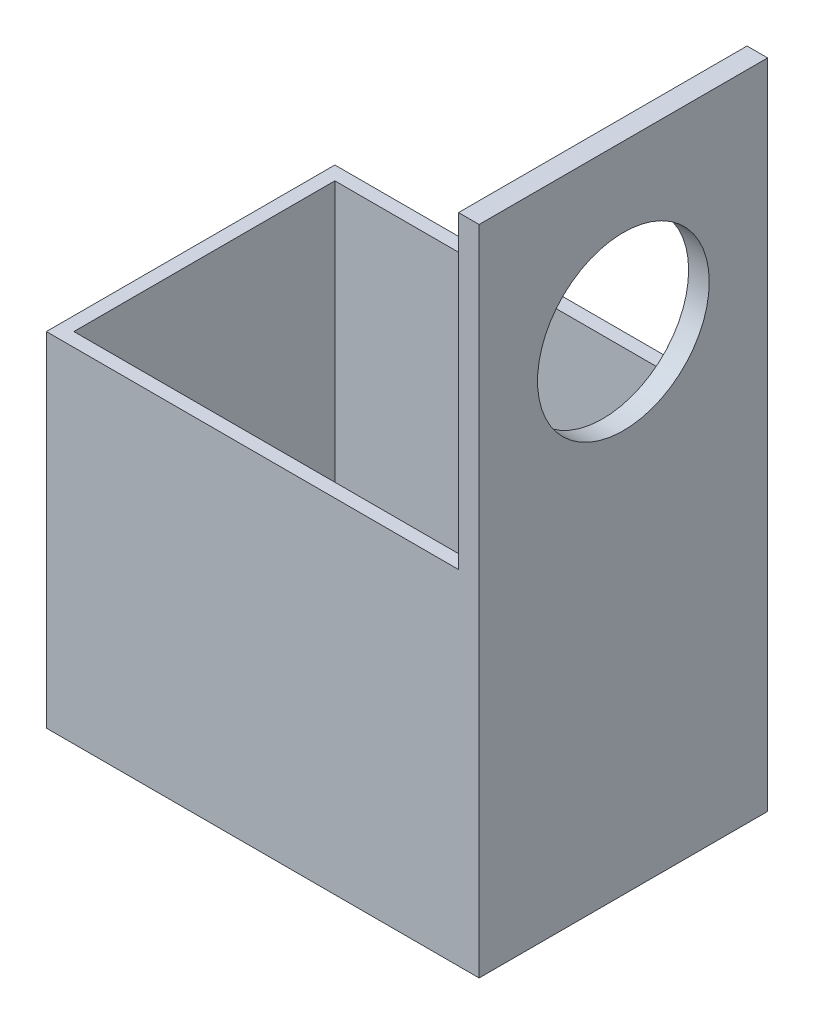
ISO-10303-21;
HEADER;
FILE_DESCRIPTION(('STEP AP214'),'2;1');
FILE_NAME('part.step','',(''),(''),'','','');
FILE_SCHEMA(('AUTOMOTIVE_DESIGN { 1 0 10303 214 1 1 1 1 }'));
ENDSEC;
DATA;
#1=APPLICATION_CONTEXT('core data for automotive mechanical design processes');
#2=APPLICATION_PROTOCOL_DEFINITION('international standard','automotive_design',2000,#1);
#3=PRODUCT_CONTEXT('',#1,'mechanical');
#4=PRODUCT('Part','Part','',(#3));
#5=PRODUCT_RELATED_PRODUCT_CATEGORY('part','',(#4));
#6=PRODUCT_DEFINITION_FORMATION('','',#4);
#7=PRODUCT_DEFINITION_CONTEXT('part definition',#1,'design');
#8=PRODUCT_DEFINITION('design','',#6,#7);
#9=PRODUCT_DEFINITION_SHAPE('','',#8);
#10=(LENGTH_UNIT() NAMED_UNIT(*) SI_UNIT(.MILLI.,.METRE.));
#11=(NAMED_UNIT(*) PLANE_ANGLE_UNIT() SI_UNIT($,.RADIAN.));
#12=(NAMED_UNIT(*) SI_UNIT($,.STERADIAN.) SOLID_ANGLE_UNIT());
#13=UNCERTAINTY_MEASURE_WITH_UNIT(LENGTH_MEASURE(1.E-05),#10,'distance_accuracy_value','');
#14=(GEOMETRIC_REPRESENTATION_CONTEXT(3) GLOBAL_UNCERTAINTY_ASSIGNED_CONTEXT((#13)) GLOBAL_UNIT_ASSIGNED_CONTEXT((#10,
#11,#12)) REPRESENTATION_CONTEXT('',''));
#15=CARTESIAN_POINT('',(0.,0.,0.));
#16=DIRECTION('',(0.,0.,1.));
#17=DIRECTION('',(1.,0.,0.));
#18=AXIS2_PLACEMENT_3D('',#15,#16,#17);
#19=CARTESIAN_POINT('',(0.,50.,0.));
#20=DIRECTION('',(0.,-1.,0.));
#21=DIRECTION('',(0.,0.,-1.));
#22=AXIS2_PLACEMENT_3D('',#19,#20,#21);
#23=PLANE('',#22);
#24=DIRECTION('',(0.,0.,-1.));
#25=VECTOR('',#24,1.);
#26=CARTESIAN_POINT('',(30.,50.,21.));
#27=LINE('',#26,#25);
#28=CARTESIAN_POINT('',(30.,50.,21.));
#29=VERTEX_POINT('',#28);
#30=CARTESIAN_POINT('',(30.,50.,-21.));
#31=VERTEX_POINT('',#30);
#32=EDGE_CURVE('E185',#29,#31,#27,.T.);
#33=ORIENTED_EDGE('',*,*,#32,.T.);
#34=DIRECTION('',(-1.,0.,0.));
#35=VECTOR('',#34,1.);
#36=CARTESIAN_POINT('',(-30.,50.,-21.));
#37=LINE('',#36,#35);
#38=CARTESIAN_POINT('',(-30.,50.,-21.));
#39=VERTEX_POINT('',#38);
#40=EDGE_CURVE('E188',#31,#39,#37,.T.);
#41=ORIENTED_EDGE('',*,*,#40,.T.);
#42=DIRECTION('',(0.,0.,1.));
#43=VECTOR('',#42,1.);
#44=CARTESIAN_POINT('',(-30.,50.,21.));
#45=LINE('',#44,#43);
#46=CARTESIAN_POINT('',(-30.,50.,21.));
#47=VERTEX_POINT('',#46);
#48=EDGE_CURVE('E190',#39,#47,#45,.T.);
#49=ORIENTED_EDGE('',*,*,#48,.T.);
#50=DIRECTION('',(1.,0.,0.));
#51=VECTOR('',#50,1.);
#52=CARTESIAN_POINT('',(-30.,50.,21.));
#53=LINE('',#52,#51);
#54=EDGE_CURVE('E192',#47,#29,#53,.T.);
#55=ORIENTED_EDGE('',*,*,#54,.T.);
#56=EDGE_LOOP('',(#33,#41,#49,#55));
#57=FACE_BOUND('',#56,.T.);
#58=DIRECTION('',(0.,0.,-1.));
#59=VECTOR('',#58,1.);
#60=CARTESIAN_POINT('',(28.,50.,19.));
#61=LINE('',#60,#59);
#62=CARTESIAN_POINT('',(28.,50.,19.));
#63=VERTEX_POINT('',#62);
#64=CARTESIAN_POINT('',(28.,50.,-19.));
#65=VERTEX_POINT('',#64);
#66=EDGE_CURVE('E159',#63,#65,#61,.T.);
#67=ORIENTED_EDGE('',*,*,#66,.F.);
#68=DIRECTION('',(1.,0.,0.));
#69=VECTOR('',#68,1.);
#70=CARTESIAN_POINT('',(-28.,50.,19.));
#71=LINE('',#70,#69);
#72=CARTESIAN_POINT('',(-28.,50.,19.));
#73=VERTEX_POINT('',#72);
#74=EDGE_CURVE('E166',#73,#63,#71,.T.);
#75=ORIENTED_EDGE('',*,*,#74,.F.);
#76=DIRECTION('',(0.,0.,1.));
#77=VECTOR('',#76,1.);
#78=CARTESIAN_POINT('',(-28.,50.,19.));
#79=LINE('',#78,#77);
#80=CARTESIAN_POINT('',(-28.,50.,-19.));
#81=VERTEX_POINT('',#80);
#82=EDGE_CURVE('E164',#81,#73,#79,.T.);
#83=ORIENTED_EDGE('',*,*,#82,.F.);
#84=DIRECTION('',(-1.,0.,0.));
#85=VECTOR('',#84,1.);
#86=CARTESIAN_POINT('',(-28.,50.,-19.));
#87=LINE('',#86,#85);
#88=EDGE_CURVE('E161',#65,#81,#87,.T.);
#89=ORIENTED_EDGE('',*,*,#88,.F.);
#90=EDGE_LOOP('',(#67,#75,#83,#89));
#91=FACE_BOUND('',#90,.T.);
#92=ADVANCED_FACE('F38',(#57,#91),#23,.F.);
#93=CARTESIAN_POINT('',(0.,0.,0.));
#94=DIRECTION('',(0.,-1.,0.));
#95=DIRECTION('',(0.,0.,-1.));
#96=AXIS2_PLACEMENT_3D('',#93,#94,#95);
#97=PLANE('',#96);
#98=DIRECTION('',(-1.,0.,0.));
#99=VECTOR('',#98,1.);
#100=CARTESIAN_POINT('',(-30.,0.,-21.));
#101=LINE('',#100,#99);
#102=CARTESIAN_POINT('',(33.,0.,-21.));
#103=VERTEX_POINT('',#102);
#104=CARTESIAN_POINT('',(-30.,0.,-21.));
#105=VERTEX_POINT('',#104);
#106=EDGE_CURVE('E184',#103,#105,#101,.T.);
#107=ORIENTED_EDGE('',*,*,#106,.F.);
#108=DIRECTION('',(0.,0.,-1.));
#109=VECTOR('',#108,1.);
#110=CARTESIAN_POINT('',(33.,0.,21.));
#111=LINE('',#110,#109);
#112=CARTESIAN_POINT('',(33.,0.,21.));
#113=VERTEX_POINT('',#112);
#114=EDGE_CURVE('E129',#113,#103,#111,.T.);
#115=ORIENTED_EDGE('',*,*,#114,.F.);
#116=DIRECTION('',(1.,0.,0.));
#117=VECTOR('',#116,1.);
#118=CARTESIAN_POINT('',(-30.,0.,21.));
#119=LINE('',#118,#117);
#120=CARTESIAN_POINT('',(-30.,0.,21.));
#121=VERTEX_POINT('',#120);
#122=EDGE_CURVE('E143',#121,#113,#119,.T.);
#123=ORIENTED_EDGE('',*,*,#122,.F.);
#124=DIRECTION('',(0.,0.,1.));
#125=VECTOR('',#124,1.);
#126=CARTESIAN_POINT('',(-30.,0.,21.));
#127=LINE('',#126,#125);
#128=EDGE_CURVE('E196',#105,#121,#127,.T.);
#129=ORIENTED_EDGE('',*,*,#128,.F.);
#130=EDGE_LOOP('',(#107,#115,#123,#129));
#131=FACE_BOUND('',#130,.T.);
#132=DIRECTION('',(1.,0.,0.));
#133=VECTOR('',#132,1.);
#134=CARTESIAN_POINT('',(-28.,0.,19.));
#135=LINE('',#134,#133);
#136=CARTESIAN_POINT('',(-28.,0.,19.));
#137=VERTEX_POINT('',#136);
#138=CARTESIAN_POINT('',(28.,0.,19.));
#139=VERTEX_POINT('',#138);
#140=EDGE_CURVE('E162',#137,#139,#135,.T.);
#141=ORIENTED_EDGE('',*,*,#140,.T.);
#142=DIRECTION('',(0.,0.,-1.));
#143=VECTOR('',#142,1.);
#144=CARTESIAN_POINT('',(28.,0.,19.));
#145=LINE('',#144,#143);
#146=CARTESIAN_POINT('',(28.,0.,-19.));
#147=VERTEX_POINT('',#146);
#148=EDGE_CURVE('E61',#139,#147,#145,.T.);
#149=ORIENTED_EDGE('',*,*,#148,.T.);
#150=DIRECTION('',(-1.,0.,0.));
#151=VECTOR('',#150,1.);
#152=CARTESIAN_POINT('',(-28.,0.,-19.));
#153=LINE('',#152,#151);
#154=CARTESIAN_POINT('',(-28.,0.,-19.));
#155=VERTEX_POINT('',#154);
#156=EDGE_CURVE('E170',#147,#155,#153,.T.);
#157=ORIENTED_EDGE('',*,*,#156,.T.);
#158=DIRECTION('',(0.,0.,1.));
#159=VECTOR('',#158,1.);
#160=CARTESIAN_POINT('',(-28.,0.,19.));
#161=LINE('',#160,#159);
#162=EDGE_CURVE('E173',#155,#137,#161,.T.);
#163=ORIENTED_EDGE('',*,*,#162,.T.);
#164=EDGE_LOOP('',(#141,#149,#157,#163));
#165=FACE_BOUND('',#164,.T.);
#166=ADVANCED_FACE('F204',(#131,#165),#97,.T.);
#167=CARTESIAN_POINT('',(-30.,50.,-21.));
#168=DIRECTION('',(0.,0.,1.));
#169=DIRECTION('',(1.,0.,0.));
#170=AXIS2_PLACEMENT_3D('',#167,#168,#169);
#171=PLANE('',#170);
#172=ORIENTED_EDGE('',*,*,#106,.T.);
#173=DIRECTION('',(0.,-1.,0.));
#174=VECTOR('',#173,1.);
#175=CARTESIAN_POINT('',(-30.,50.,-21.));
#176=LINE('',#175,#174);
#177=EDGE_CURVE('E11',#39,#105,#176,.T.);
#178=ORIENTED_EDGE('',*,*,#177,.F.);
#179=ORIENTED_EDGE('',*,*,#40,.F.);
#180=DIRECTION('',(0.,1.,0.));
#181=VECTOR('',#180,1.);
#182=CARTESIAN_POINT('',(30.,0.,-21.));
#183=LINE('',#182,#181);
#184=CARTESIAN_POINT('',(30.,95.,-21.));
#185=VERTEX_POINT('',#184);
#186=EDGE_CURVE('E145',#31,#185,#183,.T.);
#187=ORIENTED_EDGE('',*,*,#186,.T.);
#188=DIRECTION('',(-1.,0.,0.));
#189=VECTOR('',#188,1.);
#190=CARTESIAN_POINT('',(33.,95.,-21.));
#191=LINE('',#190,#189);
#192=CARTESIAN_POINT('',(33.,95.,-21.));
#193=VERTEX_POINT('',#192);
#194=EDGE_CURVE('E128',#193,#185,#191,.T.);
#195=ORIENTED_EDGE('',*,*,#194,.F.);
#196=DIRECTION('',(0.,1.,0.));
#197=VECTOR('',#196,1.);
#198=CARTESIAN_POINT('',(33.,0.,-21.));
#199=LINE('',#198,#197);
#200=EDGE_CURVE('E137',#103,#193,#199,.T.);
#201=ORIENTED_EDGE('',*,*,#200,.F.);
#202=EDGE_LOOP('',(#172,#178,#179,#187,#195,#201));
#203=FACE_BOUND('',#202,.T.);
#204=ADVANCED_FACE('F40',(#203),#171,.F.);
#205=CARTESIAN_POINT('',(-30.,50.,21.));
#206=DIRECTION('',(1.,0.,0.));
#207=DIRECTION('',(0.,0.,-1.));
#208=AXIS2_PLACEMENT_3D('',#205,#206,#207);
#209=PLANE('',#208);
#210=ORIENTED_EDGE('',*,*,#128,.T.);
#211=DIRECTION('',(0.,-1.,0.));
#212=VECTOR('',#211,1.);
#213=CARTESIAN_POINT('',(-30.,50.,21.));
#214=LINE('',#213,#212);
#215=EDGE_CURVE('E46',#47,#121,#214,.T.);
#216=ORIENTED_EDGE('',*,*,#215,.F.);
#217=ORIENTED_EDGE('',*,*,#48,.F.);
#218=ORIENTED_EDGE('',*,*,#177,.T.);
#219=EDGE_LOOP('',(#210,#216,#217,#218));
#220=FACE_BOUND('',#219,.T.);
#221=ADVANCED_FACE('F213',(#220),#209,.F.);
#222=CARTESIAN_POINT('',(-30.,50.,21.));
#223=DIRECTION('',(0.,0.,-1.));
#224=DIRECTION('',(-1.,0.,0.));
#225=AXIS2_PLACEMENT_3D('',#222,#223,#224);
#226=PLANE('',#225);
#227=ORIENTED_EDGE('',*,*,#122,.T.);
#228=DIRECTION('',(0.,1.,0.));
#229=VECTOR('',#228,1.);
#230=CARTESIAN_POINT('',(33.,0.,21.));
#231=LINE('',#230,#229);
#232=CARTESIAN_POINT('',(33.,95.,21.));
#233=VERTEX_POINT('',#232);
#234=EDGE_CURVE('E135',#113,#233,#231,.T.);
#235=ORIENTED_EDGE('',*,*,#234,.T.);
#236=DIRECTION('',(-1.,0.,0.));
#237=VECTOR('',#236,1.);
#238=CARTESIAN_POINT('',(33.,95.,21.));
#239=LINE('',#238,#237);
#240=CARTESIAN_POINT('',(30.,95.,21.));
#241=VERTEX_POINT('',#240);
#242=EDGE_CURVE('E118',#233,#241,#239,.T.);
#243=ORIENTED_EDGE('',*,*,#242,.T.);
#244=DIRECTION('',(0.,1.,0.));
#245=VECTOR('',#244,1.);
#246=CARTESIAN_POINT('',(30.,0.,21.));
#247=LINE('',#246,#245);
#248=EDGE_CURVE('E154',#29,#241,#247,.T.);
#249=ORIENTED_EDGE('',*,*,#248,.F.);
#250=ORIENTED_EDGE('',*,*,#54,.F.);
#251=ORIENTED_EDGE('',*,*,#215,.T.);
#252=EDGE_LOOP('',(#227,#235,#243,#249,#250,#251));
#253=FACE_BOUND('',#252,.T.);
#254=ADVANCED_FACE('F140',(#253),#226,.F.);
#255=CARTESIAN_POINT('',(28.,50.,19.));
#256=DIRECTION('',(-1.,0.,0.));
#257=DIRECTION('',(0.,0.,1.));
#258=AXIS2_PLACEMENT_3D('',#255,#256,#257);
#259=PLANE('',#258);
#260=ORIENTED_EDGE('',*,*,#148,.F.);
#261=DIRECTION('',(0.,-1.,0.));
#262=VECTOR('',#261,1.);
#263=CARTESIAN_POINT('',(28.,50.,19.));
#264=LINE('',#263,#262);
#265=EDGE_CURVE('E168',#63,#139,#264,.T.);
#266=ORIENTED_EDGE('',*,*,#265,.F.);
#267=ORIENTED_EDGE('',*,*,#66,.T.);
#268=DIRECTION('',(0.,-1.,0.));
#269=VECTOR('',#268,1.);
#270=CARTESIAN_POINT('',(28.,50.,-19.));
#271=LINE('',#270,#269);
#272=EDGE_CURVE('E182',#65,#147,#271,.T.);
#273=ORIENTED_EDGE('',*,*,#272,.T.);
#274=EDGE_LOOP('',(#260,#266,#267,#273));
#275=FACE_BOUND('',#274,.T.);
#276=ADVANCED_FACE('F219',(#275),#259,.T.);
#277=CARTESIAN_POINT('',(-28.,50.,-19.));
#278=DIRECTION('',(0.,0.,1.));
#279=DIRECTION('',(1.,0.,0.));
#280=AXIS2_PLACEMENT_3D('',#277,#278,#279);
#281=PLANE('',#280);
#282=ORIENTED_EDGE('',*,*,#156,.F.);
#283=ORIENTED_EDGE('',*,*,#272,.F.);
#284=ORIENTED_EDGE('',*,*,#88,.T.);
#285=DIRECTION('',(0.,-1.,0.));
#286=VECTOR('',#285,1.);
#287=CARTESIAN_POINT('',(-28.,50.,-19.));
#288=LINE('',#287,#286);
#289=EDGE_CURVE('E180',#81,#155,#288,.T.);
#290=ORIENTED_EDGE('',*,*,#289,.T.);
#291=EDGE_LOOP('',(#282,#283,#284,#290));
#292=FACE_BOUND('',#291,.T.);
#293=ADVANCED_FACE('F230',(#292),#281,.T.);
#294=CARTESIAN_POINT('',(-28.,50.,19.));
#295=DIRECTION('',(1.,0.,0.));
#296=DIRECTION('',(0.,0.,-1.));
#297=AXIS2_PLACEMENT_3D('',#294,#295,#296);
#298=PLANE('',#297);
#299=ORIENTED_EDGE('',*,*,#162,.F.);
#300=ORIENTED_EDGE('',*,*,#289,.F.);
#301=ORIENTED_EDGE('',*,*,#82,.T.);
#302=DIRECTION('',(0.,-1.,0.));
#303=VECTOR('',#302,1.);
#304=CARTESIAN_POINT('',(-28.,50.,19.));
#305=LINE('',#304,#303);
#306=EDGE_CURVE('E53',#73,#137,#305,.T.);
#307=ORIENTED_EDGE('',*,*,#306,.T.);
#308=EDGE_LOOP('',(#299,#300,#301,#307));
#309=FACE_BOUND('',#308,.T.);
#310=ADVANCED_FACE('F233',(#309),#298,.T.);
#311=CARTESIAN_POINT('',(-28.,50.,19.));
#312=DIRECTION('',(0.,0.,-1.));
#313=DIRECTION('',(-1.,0.,0.));
#314=AXIS2_PLACEMENT_3D('',#311,#312,#313);
#315=PLANE('',#314);
#316=ORIENTED_EDGE('',*,*,#140,.F.);
#317=ORIENTED_EDGE('',*,*,#306,.F.);
#318=ORIENTED_EDGE('',*,*,#74,.T.);
#319=ORIENTED_EDGE('',*,*,#265,.T.);
#320=EDGE_LOOP('',(#316,#317,#318,#319));
#321=FACE_BOUND('',#320,.T.);
#322=ADVANCED_FACE('F237',(#321),#315,.T.);
#323=CARTESIAN_POINT('',(30.,0.,0.));
#324=DIRECTION('',(-1.,0.,0.));
#325=DIRECTION('',(0.,0.,1.));
#326=AXIS2_PLACEMENT_3D('',#323,#324,#325);
#327=PLANE('',#326);
#328=CARTESIAN_POINT('',(30.,71.,0.));
#329=DIRECTION('',(1.,0.,0.));
#330=DIRECTION('',(0.,0.,-1.));
#331=AXIS2_PLACEMENT_3D('',#328,#329,#330);
#332=CIRCLE('',#331,12.5);
#333=CARTESIAN_POINT('',(30.,71.,-12.5));
#334=VERTEX_POINT('',#333);
#335=EDGE_CURVE('E156',#334,#334,#332,.T.);
#336=ORIENTED_EDGE('',*,*,#335,.T.);
#337=EDGE_LOOP('',(#336));
#338=FACE_BOUND('',#337,.T.);
#339=ORIENTED_EDGE('',*,*,#32,.F.);
#340=ORIENTED_EDGE('',*,*,#248,.T.);
#341=DIRECTION('',(0.,0.,-1.));
#342=VECTOR('',#341,1.);
#343=CARTESIAN_POINT('',(30.,95.,21.));
#344=LINE('',#343,#342);
#345=EDGE_CURVE('E124',#241,#185,#344,.T.);
#346=ORIENTED_EDGE('',*,*,#345,.T.);
#347=ORIENTED_EDGE('',*,*,#186,.F.);
#348=EDGE_LOOP('',(#339,#340,#346,#347));
#349=FACE_BOUND('',#348,.T.);
#350=ADVANCED_FACE('F210',(#338,#349),#327,.T.);
#351=CARTESIAN_POINT('',(33.,95.,21.));
#352=DIRECTION('',(0.,1.,0.));
#353=DIRECTION('',(0.,0.,1.));
#354=AXIS2_PLACEMENT_3D('',#351,#352,#353);
#355=PLANE('',#354);
#356=ORIENTED_EDGE('',*,*,#345,.F.);
#357=ORIENTED_EDGE('',*,*,#242,.F.);
#358=DIRECTION('',(0.,0.,-1.));
#359=VECTOR('',#358,1.);
#360=CARTESIAN_POINT('',(33.,95.,21.));
#361=LINE('',#360,#359);
#362=EDGE_CURVE('E122',#233,#193,#361,.T.);
#363=ORIENTED_EDGE('',*,*,#362,.T.);
#364=ORIENTED_EDGE('',*,*,#194,.T.);
#365=EDGE_LOOP('',(#356,#357,#363,#364));
#366=FACE_BOUND('',#365,.T.);
#367=ADVANCED_FACE('F120',(#366),#355,.T.);
#368=CARTESIAN_POINT('',(33.,0.,0.));
#369=DIRECTION('',(-1.,0.,0.));
#370=DIRECTION('',(0.,0.,1.));
#371=AXIS2_PLACEMENT_3D('',#368,#369,#370);
#372=PLANE('',#371);
#373=CARTESIAN_POINT('',(33.,71.,0.));
#374=DIRECTION('',(1.,0.,0.));
#375=DIRECTION('',(0.,0.,-1.));
#376=AXIS2_PLACEMENT_3D('',#373,#374,#375);
#377=CIRCLE('',#376,12.5);
#378=CARTESIAN_POINT('',(33.,71.,-12.5));
#379=VERTEX_POINT('',#378);
#380=EDGE_CURVE('E149',#379,#379,#377,.T.);
#381=ORIENTED_EDGE('',*,*,#380,.F.);
#382=EDGE_LOOP('',(#381));
#383=FACE_BOUND('',#382,.T.);
#384=ORIENTED_EDGE('',*,*,#234,.F.);
#385=ORIENTED_EDGE('',*,*,#114,.T.);
#386=ORIENTED_EDGE('',*,*,#200,.T.);
#387=ORIENTED_EDGE('',*,*,#362,.F.);
#388=EDGE_LOOP('',(#384,#385,#386,#387));
#389=FACE_BOUND('',#388,.T.);
#390=ADVANCED_FACE('F133',(#383,#389),#372,.F.);
#391=CARTESIAN_POINT('',(30.,71.,0.));
#392=DIRECTION('',(1.,0.,0.));
#393=DIRECTION('',(0.,0.,-1.));
#394=AXIS2_PLACEMENT_3D('',#391,#392,#393);
#395=CYLINDRICAL_SURFACE('',#394,12.5);
#396=ORIENTED_EDGE('',*,*,#335,.F.);
#397=EDGE_LOOP('',(#396));
#398=FACE_BOUND('',#397,.T.);
#399=ORIENTED_EDGE('',*,*,#380,.T.);
#400=EDGE_LOOP('',(#399));
#401=FACE_BOUND('',#400,.T.);
#402=ADVANCED_FACE('F248',(#398,#401),#395,.F.);
#403=CLOSED_SHELL('',(#92,#166,#204,#221,#254,#276,#293,#310,#322,#350,#367,#390,#402));
#404=MANIFOLD_SOLID_BREP('B2',#403);
#405=ADVANCED_BREP_SHAPE_REPRESENTATION('',(#18,#404),#14);
#406=SHAPE_DEFINITION_REPRESENTATION(#9,#405);
ENDSEC;
END-ISO-10303-21;
